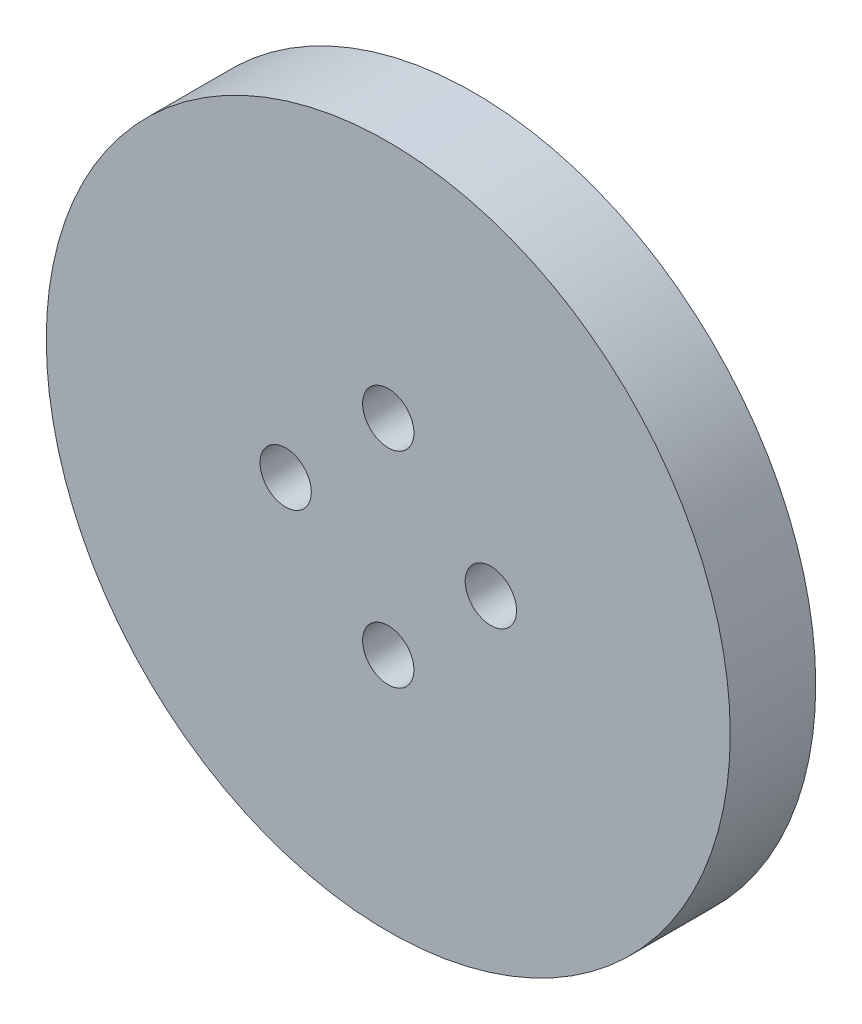
ISO-10303-21;
HEADER;
FILE_DESCRIPTION(('STEP AP214'),'2;1');
FILE_NAME('part.step','',(''),(''),'','','');
FILE_SCHEMA(('AUTOMOTIVE_DESIGN { 1 0 10303 214 1 1 1 1 }'));
ENDSEC;
DATA;
#1=APPLICATION_CONTEXT('core data for automotive mechanical design processes');
#2=APPLICATION_PROTOCOL_DEFINITION('international standard','automotive_design',2000,#1);
#3=PRODUCT_CONTEXT('',#1,'mechanical');
#4=PRODUCT('Part','Part','',(#3));
#5=PRODUCT_RELATED_PRODUCT_CATEGORY('part','',(#4));
#6=PRODUCT_DEFINITION_FORMATION('','',#4);
#7=PRODUCT_DEFINITION_CONTEXT('part definition',#1,'design');
#8=PRODUCT_DEFINITION('design','',#6,#7);
#9=PRODUCT_DEFINITION_SHAPE('','',#8);
#10=(LENGTH_UNIT() NAMED_UNIT(*) SI_UNIT(.MILLI.,.METRE.));
#11=(NAMED_UNIT(*) PLANE_ANGLE_UNIT() SI_UNIT($,.RADIAN.));
#12=(NAMED_UNIT(*) SI_UNIT($,.STERADIAN.) SOLID_ANGLE_UNIT());
#13=UNCERTAINTY_MEASURE_WITH_UNIT(LENGTH_MEASURE(1.E-05),#10,'distance_accuracy_value','');
#14=(GEOMETRIC_REPRESENTATION_CONTEXT(3) GLOBAL_UNCERTAINTY_ASSIGNED_CONTEXT((#13)) GLOBAL_UNIT_ASSIGNED_CONTEXT((#10,
#11,#12)) REPRESENTATION_CONTEXT('',''));
#15=CARTESIAN_POINT('',(0.,0.,0.));
#16=DIRECTION('',(0.,0.,1.));
#17=DIRECTION('',(1.,0.,0.));
#18=AXIS2_PLACEMENT_3D('',#15,#16,#17);
#19=CARTESIAN_POINT('',(12.,0.,10.));
#20=DIRECTION('',(0.,0.,-1.));
#21=DIRECTION('',(-1.,0.,0.));
#22=AXIS2_PLACEMENT_3D('',#19,#20,#21);
#23=CYLINDRICAL_SURFACE('',#22,3.);
#24=CARTESIAN_POINT('',(12.,0.,10.));
#25=DIRECTION('',(0.,0.,1.));
#26=DIRECTION('',(1.,0.,0.));
#27=AXIS2_PLACEMENT_3D('',#24,#25,#26);
#28=CIRCLE('',#27,3.);
#29=CARTESIAN_POINT('',(15.,0.,10.));
#30=VERTEX_POINT('',#29);
#31=EDGE_CURVE('E10',#30,#30,#28,.T.);
#32=ORIENTED_EDGE('',*,*,#31,.T.);
#33=EDGE_LOOP('',(#32));
#34=FACE_BOUND('',#33,.T.);
#35=CARTESIAN_POINT('',(12.,0.,0.));
#36=DIRECTION('',(0.,0.,1.));
#37=DIRECTION('',(1.,0.,0.));
#38=AXIS2_PLACEMENT_3D('',#35,#36,#37);
#39=CIRCLE('',#38,3.);
#40=CARTESIAN_POINT('',(15.,0.,0.));
#41=VERTEX_POINT('',#40);
#42=EDGE_CURVE('E43',#41,#41,#39,.T.);
#43=ORIENTED_EDGE('',*,*,#42,.F.);
#44=EDGE_LOOP('',(#43));
#45=FACE_BOUND('',#44,.T.);
#46=ADVANCED_FACE('F39',(#34,#45),#23,.F.);
#47=CARTESIAN_POINT('',(0.,12.,10.));
#48=DIRECTION('',(0.,0.,-1.));
#49=DIRECTION('',(-1.,0.,0.));
#50=AXIS2_PLACEMENT_3D('',#47,#48,#49);
#51=CYLINDRICAL_SURFACE('',#50,3.);
#52=CARTESIAN_POINT('',(0.,12.,10.));
#53=DIRECTION('',(0.,0.,1.));
#54=DIRECTION('',(1.,0.,0.));
#55=AXIS2_PLACEMENT_3D('',#52,#53,#54);
#56=CIRCLE('',#55,3.);
#57=CARTESIAN_POINT('',(3.00000000000004,12.,10.));
#58=VERTEX_POINT('',#57);
#59=EDGE_CURVE('E47',#58,#58,#56,.T.);
#60=ORIENTED_EDGE('',*,*,#59,.T.);
#61=EDGE_LOOP('',(#60));
#62=FACE_BOUND('',#61,.T.);
#63=CARTESIAN_POINT('',(0.,12.,0.));
#64=DIRECTION('',(0.,0.,1.));
#65=DIRECTION('',(1.,0.,0.));
#66=AXIS2_PLACEMENT_3D('',#63,#64,#65);
#67=CIRCLE('',#66,3.);
#68=CARTESIAN_POINT('',(3.00000000000004,12.,0.));
#69=VERTEX_POINT('',#68);
#70=EDGE_CURVE('E62',#69,#69,#67,.T.);
#71=ORIENTED_EDGE('',*,*,#70,.F.);
#72=EDGE_LOOP('',(#71));
#73=FACE_BOUND('',#72,.T.);
#74=ADVANCED_FACE('F100',(#62,#73),#51,.F.);
#75=CARTESIAN_POINT('',(-12.,0.,10.));
#76=DIRECTION('',(0.,0.,-1.));
#77=DIRECTION('',(-1.,0.,0.));
#78=AXIS2_PLACEMENT_3D('',#75,#76,#77);
#79=CYLINDRICAL_SURFACE('',#78,3.);
#80=CARTESIAN_POINT('',(-12.,0.,10.));
#81=DIRECTION('',(0.,0.,1.));
#82=DIRECTION('',(1.,0.,0.));
#83=AXIS2_PLACEMENT_3D('',#80,#81,#82);
#84=CIRCLE('',#83,3.);
#85=CARTESIAN_POINT('',(-9.,0.,10.));
#86=VERTEX_POINT('',#85);
#87=EDGE_CURVE('E52',#86,#86,#84,.T.);
#88=ORIENTED_EDGE('',*,*,#87,.T.);
#89=EDGE_LOOP('',(#88));
#90=FACE_BOUND('',#89,.T.);
#91=CARTESIAN_POINT('',(-12.,0.,0.));
#92=DIRECTION('',(0.,0.,1.));
#93=DIRECTION('',(1.,0.,0.));
#94=AXIS2_PLACEMENT_3D('',#91,#92,#93);
#95=CIRCLE('',#94,3.);
#96=CARTESIAN_POINT('',(-9.,0.,0.));
#97=VERTEX_POINT('',#96);
#98=EDGE_CURVE('E59',#97,#97,#95,.T.);
#99=ORIENTED_EDGE('',*,*,#98,.F.);
#100=EDGE_LOOP('',(#99));
#101=FACE_BOUND('',#100,.T.);
#102=ADVANCED_FACE('F104',(#90,#101),#79,.F.);
#103=CARTESIAN_POINT('',(-1.25693328198353E-13,-12.,10.));
#104=DIRECTION('',(0.,0.,-1.));
#105=DIRECTION('',(-1.,0.,0.));
#106=AXIS2_PLACEMENT_3D('',#103,#104,#105);
#107=CYLINDRICAL_SURFACE('',#106,3.);
#108=CARTESIAN_POINT('',(-1.25693328198353E-13,-12.,10.));
#109=DIRECTION('',(0.,0.,1.));
#110=DIRECTION('',(1.,0.,0.));
#111=AXIS2_PLACEMENT_3D('',#108,#109,#110);
#112=CIRCLE('',#111,3.);
#113=CARTESIAN_POINT('',(2.99999999999987,-12.,10.));
#114=VERTEX_POINT('',#113);
#115=EDGE_CURVE('E67',#114,#114,#112,.T.);
#116=ORIENTED_EDGE('',*,*,#115,.T.);
#117=EDGE_LOOP('',(#116));
#118=FACE_BOUND('',#117,.T.);
#119=CARTESIAN_POINT('',(-1.25693328198353E-13,-12.,0.));
#120=DIRECTION('',(0.,0.,1.));
#121=DIRECTION('',(1.,0.,0.));
#122=AXIS2_PLACEMENT_3D('',#119,#120,#121);
#123=CIRCLE('',#122,3.);
#124=CARTESIAN_POINT('',(2.99999999999987,-12.,0.));
#125=VERTEX_POINT('',#124);
#126=EDGE_CURVE('E56',#125,#125,#123,.T.);
#127=ORIENTED_EDGE('',*,*,#126,.F.);
#128=EDGE_LOOP('',(#127));
#129=FACE_BOUND('',#128,.T.);
#130=ADVANCED_FACE('F41',(#118,#129),#107,.F.);
#131=CARTESIAN_POINT('',(0.,0.,10.));
#132=DIRECTION('',(0.,0.,1.));
#133=DIRECTION('',(1.,0.,0.));
#134=AXIS2_PLACEMENT_3D('',#131,#132,#133);
#135=PLANE('',#134);
#136=ORIENTED_EDGE('',*,*,#115,.F.);
#137=EDGE_LOOP('',(#136));
#138=FACE_BOUND('',#137,.T.);
#139=ORIENTED_EDGE('',*,*,#87,.F.);
#140=EDGE_LOOP('',(#139));
#141=FACE_BOUND('',#140,.T.);
#142=ORIENTED_EDGE('',*,*,#59,.F.);
#143=EDGE_LOOP('',(#142));
#144=FACE_BOUND('',#143,.T.);
#145=ORIENTED_EDGE('',*,*,#31,.F.);
#146=EDGE_LOOP('',(#145));
#147=FACE_BOUND('',#146,.T.);
#148=CARTESIAN_POINT('',(0.,0.,10.));
#149=DIRECTION('',(0.,0.,1.));
#150=DIRECTION('',(1.,0.,0.));
#151=AXIS2_PLACEMENT_3D('',#148,#149,#150);
#152=CIRCLE('',#151,40.);
#153=CARTESIAN_POINT('',(40.,0.,10.));
#154=VERTEX_POINT('',#153);
#155=EDGE_CURVE('E76',#154,#154,#152,.T.);
#156=ORIENTED_EDGE('',*,*,#155,.T.);
#157=EDGE_LOOP('',(#156));
#158=FACE_BOUND('',#157,.T.);
#159=ADVANCED_FACE('F87',(#138,#141,#144,#147,#158),#135,.T.);
#160=CARTESIAN_POINT('',(0.,0.,0.));
#161=DIRECTION('',(0.,0.,1.));
#162=DIRECTION('',(1.,0.,0.));
#163=AXIS2_PLACEMENT_3D('',#160,#161,#162);
#164=PLANE('',#163);
#165=ORIENTED_EDGE('',*,*,#126,.T.);
#166=EDGE_LOOP('',(#165));
#167=FACE_BOUND('',#166,.T.);
#168=ORIENTED_EDGE('',*,*,#98,.T.);
#169=EDGE_LOOP('',(#168));
#170=FACE_BOUND('',#169,.T.);
#171=ORIENTED_EDGE('',*,*,#70,.T.);
#172=EDGE_LOOP('',(#171));
#173=FACE_BOUND('',#172,.T.);
#174=ORIENTED_EDGE('',*,*,#42,.T.);
#175=EDGE_LOOP('',(#174));
#176=FACE_BOUND('',#175,.T.);
#177=CARTESIAN_POINT('',(0.,0.,0.));
#178=DIRECTION('',(0.,0.,1.));
#179=DIRECTION('',(1.,0.,0.));
#180=AXIS2_PLACEMENT_3D('',#177,#178,#179);
#181=CIRCLE('',#180,40.);
#182=CARTESIAN_POINT('',(40.,0.,0.));
#183=VERTEX_POINT('',#182);
#184=EDGE_CURVE('E60',#183,#183,#181,.T.);
#185=ORIENTED_EDGE('',*,*,#184,.F.);
#186=EDGE_LOOP('',(#185));
#187=FACE_BOUND('',#186,.T.);
#188=ADVANCED_FACE('F85',(#167,#170,#173,#176,#187),#164,.F.);
#189=CARTESIAN_POINT('',(0.,0.,0.));
#190=DIRECTION('',(0.,0.,1.));
#191=DIRECTION('',(1.,0.,0.));
#192=AXIS2_PLACEMENT_3D('',#189,#190,#191);
#193=CYLINDRICAL_SURFACE('',#192,40.);
#194=ORIENTED_EDGE('',*,*,#184,.T.);
#195=EDGE_LOOP('',(#194));
#196=FACE_BOUND('',#195,.T.);
#197=ORIENTED_EDGE('',*,*,#155,.F.);
#198=EDGE_LOOP('',(#197));
#199=FACE_BOUND('',#198,.T.);
#200=ADVANCED_FACE('F82',(#196,#199),#193,.T.);
#201=CLOSED_SHELL('',(#46,#74,#102,#130,#159,#188,#200));
#202=MANIFOLD_SOLID_BREP('B2',#201);
#203=ADVANCED_BREP_SHAPE_REPRESENTATION('',(#18,#202),#14);
#204=SHAPE_DEFINITION_REPRESENTATION(#9,#203);
ENDSEC;
END-ISO-10303-21;
